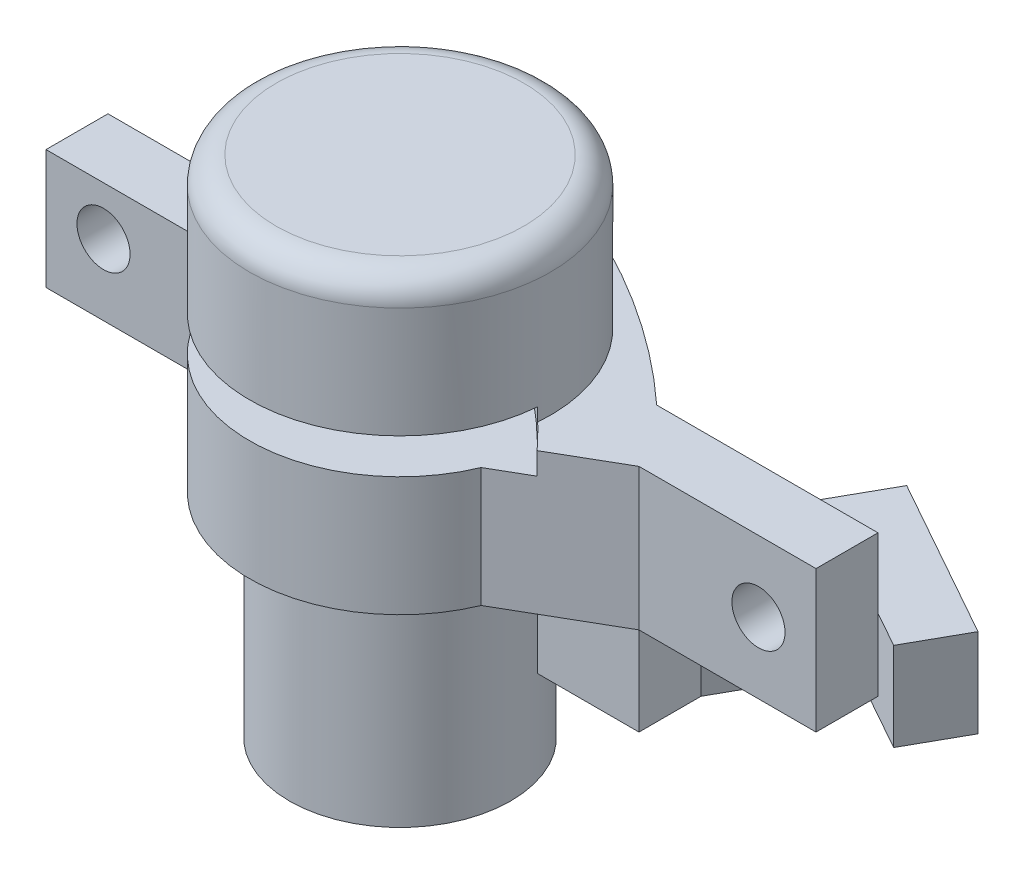
ISO-10303-21;
HEADER;
FILE_DESCRIPTION(('STEP AP214'),'2;1');
FILE_NAME('part.step','',(''),(''),'','','');
FILE_SCHEMA(('AUTOMOTIVE_DESIGN { 1 0 10303 214 1 1 1 1 }'));
ENDSEC;
DATA;
#1=APPLICATION_CONTEXT('core data for automotive mechanical design processes');
#2=APPLICATION_PROTOCOL_DEFINITION('international standard','automotive_design',2000,#1);
#3=PRODUCT_CONTEXT('',#1,'mechanical');
#4=PRODUCT('Part','Part','',(#3));
#5=PRODUCT_RELATED_PRODUCT_CATEGORY('part','',(#4));
#6=PRODUCT_DEFINITION_FORMATION('','',#4);
#7=PRODUCT_DEFINITION_CONTEXT('part definition',#1,'design');
#8=PRODUCT_DEFINITION('design','',#6,#7);
#9=PRODUCT_DEFINITION_SHAPE('','',#8);
#10=(LENGTH_UNIT() NAMED_UNIT(*) SI_UNIT(.MILLI.,.METRE.));
#11=(NAMED_UNIT(*) PLANE_ANGLE_UNIT() SI_UNIT($,.RADIAN.));
#12=(NAMED_UNIT(*) SI_UNIT($,.STERADIAN.) SOLID_ANGLE_UNIT());
#13=UNCERTAINTY_MEASURE_WITH_UNIT(LENGTH_MEASURE(1.E-05),#10,'distance_accuracy_value','');
#14=(GEOMETRIC_REPRESENTATION_CONTEXT(3) GLOBAL_UNCERTAINTY_ASSIGNED_CONTEXT((#13)) GLOBAL_UNIT_ASSIGNED_CONTEXT((#10,
#11,#12)) REPRESENTATION_CONTEXT('',''));
#15=CARTESIAN_POINT('',(0.,0.,0.));
#16=DIRECTION('',(0.,0.,1.));
#17=DIRECTION('',(1.,0.,0.));
#18=AXIS2_PLACEMENT_3D('',#15,#16,#17);
#19=CARTESIAN_POINT('',(0.,16.,0.));
#20=DIRECTION('',(1.,0.,0.));
#21=DIRECTION('',(0.,0.,-1.));
#22=AXIS2_PLACEMENT_3D('',#19,#20,#21);
#23=PLANE('',#22);
#24=DIRECTION('',(0.,0.,1.));
#25=VECTOR('',#24,1.);
#26=CARTESIAN_POINT('',(0.,13.5,0.));
#27=LINE('',#26,#25);
#28=CARTESIAN_POINT('',(0.,13.5,-7.));
#29=VERTEX_POINT('',#28);
#30=CARTESIAN_POINT('',(0.,13.5,0.));
#31=VERTEX_POINT('',#30);
#32=EDGE_CURVE('E384',#29,#31,#27,.T.);
#33=ORIENTED_EDGE('',*,*,#32,.F.);
#34=DIRECTION('',(0.,-1.,0.));
#35=VECTOR('',#34,1.);
#36=CARTESIAN_POINT('',(0.,16.,-7.));
#37=LINE('',#36,#35);
#38=CARTESIAN_POINT('',(0.,0.,-7.));
#39=VERTEX_POINT('',#38);
#40=EDGE_CURVE('E247',#29,#39,#37,.T.);
#41=ORIENTED_EDGE('',*,*,#40,.T.);
#42=DIRECTION('',(0.,0.,1.));
#43=VECTOR('',#42,1.);
#44=CARTESIAN_POINT('',(0.,0.,0.));
#45=LINE('',#44,#43);
#46=CARTESIAN_POINT('',(0.,0.,0.));
#47=VERTEX_POINT('',#46);
#48=EDGE_CURVE('E280',#39,#47,#45,.T.);
#49=ORIENTED_EDGE('',*,*,#48,.T.);
#50=DIRECTION('',(0.,-1.,0.));
#51=VECTOR('',#50,1.);
#52=CARTESIAN_POINT('',(0.,16.,0.));
#53=LINE('',#52,#51);
#54=EDGE_CURVE('E221',#31,#47,#53,.T.);
#55=ORIENTED_EDGE('',*,*,#54,.F.);
#56=EDGE_LOOP('',(#33,#41,#49,#55));
#57=FACE_BOUND('',#56,.T.);
#58=ADVANCED_FACE('F36',(#57),#23,.F.);
#59=CARTESIAN_POINT('',(0.,16.,0.));
#60=DIRECTION('',(0.,0.,-1.));
#61=DIRECTION('',(-1.,0.,0.));
#62=AXIS2_PLACEMENT_3D('',#59,#60,#61);
#63=PLANE('',#62);
#64=CARTESIAN_POINT('',(6.49999999999999,8.,0.));
#65=DIRECTION('',(0.,0.,-1.));
#66=DIRECTION('',(-1.,0.,0.));
#67=AXIS2_PLACEMENT_3D('',#64,#65,#66);
#68=CIRCLE('',#67,3.);
#69=CARTESIAN_POINT('',(3.49999999999999,8.,0.));
#70=VERTEX_POINT('',#69);
#71=EDGE_CURVE('E306',#70,#70,#68,.T.);
#72=ORIENTED_EDGE('',*,*,#71,.T.);
#73=EDGE_LOOP('',(#72));
#74=FACE_BOUND('',#73,.T.);
#75=DIRECTION('',(1.,0.,0.));
#76=VECTOR('',#75,1.);
#77=CARTESIAN_POINT('',(0.,13.5,0.));
#78=LINE('',#77,#76);
#79=CARTESIAN_POINT('',(23.,13.5,0.));
#80=VERTEX_POINT('',#79);
#81=EDGE_CURVE('E382',#31,#80,#78,.T.);
#82=ORIENTED_EDGE('',*,*,#81,.F.);
#83=ORIENTED_EDGE('',*,*,#54,.T.);
#84=DIRECTION('',(1.,0.,0.));
#85=VECTOR('',#84,1.);
#86=CARTESIAN_POINT('',(0.,0.,0.));
#87=LINE('',#86,#85);
#88=CARTESIAN_POINT('',(23.,0.,0.));
#89=VERTEX_POINT('',#88);
#90=EDGE_CURVE('E277',#47,#89,#87,.T.);
#91=ORIENTED_EDGE('',*,*,#90,.T.);
#92=DIRECTION('',(0.,-1.,0.));
#93=VECTOR('',#92,1.);
#94=CARTESIAN_POINT('',(23.,16.,0.));
#95=LINE('',#94,#93);
#96=EDGE_CURVE('E223',#80,#89,#95,.T.);
#97=ORIENTED_EDGE('',*,*,#96,.F.);
#98=EDGE_LOOP('',(#82,#83,#91,#97));
#99=FACE_BOUND('',#98,.T.);
#100=ADVANCED_FACE('F414',(#74,#99),#63,.F.);
#101=CARTESIAN_POINT('',(40.,16.,0.));
#102=DIRECTION('',(0.,-1.,0.));
#103=DIRECTION('',(0.,0.,-1.));
#104=AXIS2_PLACEMENT_3D('',#101,#102,#103);
#105=CYLINDRICAL_SURFACE('',#104,17.);
#106=CARTESIAN_POINT('',(40.,30.,0.));
#107=DIRECTION('',(0.,1.,0.));
#108=DIRECTION('',(0.,0.,1.));
#109=AXIS2_PLACEMENT_3D('',#106,#107,#108);
#110=CIRCLE('',#109,17.);
#111=CARTESIAN_POINT('',(40.,30.,17.));
#112=VERTEX_POINT('',#111);
#113=EDGE_CURVE('E11',#112,#112,#110,.F.);
#114=ORIENTED_EDGE('',*,*,#113,.T.);
#115=EDGE_LOOP('',(#114));
#116=FACE_BOUND('',#115,.T.);
#117=DIRECTION('',(0.,-1.,0.));
#118=VECTOR('',#117,1.);
#119=CARTESIAN_POINT('',(32.3442089952623,15.5,-15.1785659431903));
#120=LINE('',#119,#118);
#121=CARTESIAN_POINT('',(32.3442089952622,17.5,-15.1785659431903));
#122=VERTEX_POINT('',#121);
#123=CARTESIAN_POINT('',(32.3442089952623,16.,-15.1785659431903));
#124=VERTEX_POINT('',#123);
#125=EDGE_CURVE('E209',#122,#124,#120,.T.);
#126=ORIENTED_EDGE('',*,*,#125,.F.);
#127=CARTESIAN_POINT('',(40.,17.5,0.));
#128=DIRECTION('',(0.,1.,0.));
#129=DIRECTION('',(0.,0.,1.));
#130=AXIS2_PLACEMENT_3D('',#127,#128,#129);
#131=CIRCLE('',#130,17.);
#132=CARTESIAN_POINT('',(56.9434916866743,17.5,1.38495106902715));
#133=VERTEX_POINT('',#132);
#134=EDGE_CURVE('E205',#122,#133,#131,.T.);
#135=ORIENTED_EDGE('',*,*,#134,.T.);
#136=DIRECTION('',(0.,-1.,0.));
#137=VECTOR('',#136,1.);
#138=CARTESIAN_POINT('',(56.9434916866743,15.5,1.38495106902711));
#139=LINE('',#138,#137);
#140=CARTESIAN_POINT('',(56.9434916866743,16.,1.38495106902711));
#141=VERTEX_POINT('',#140);
#142=EDGE_CURVE('E191',#141,#133,#139,.F.);
#143=ORIENTED_EDGE('',*,*,#142,.F.);
#144=CARTESIAN_POINT('',(40.,16.,0.));
#145=DIRECTION('',(0.,1.,0.));
#146=DIRECTION('',(0.,0.,1.));
#147=AXIS2_PLACEMENT_3D('',#144,#145,#146);
#148=CIRCLE('',#147,17.);
#149=EDGE_CURVE('E283',#141,#124,#148,.T.);
#150=ORIENTED_EDGE('',*,*,#149,.T.);
#151=EDGE_LOOP('',(#126,#135,#143,#150));
#152=FACE_BOUND('',#151,.T.);
#153=ADVANCED_FACE('F208',(#116,#152),#105,.T.);
#154=CARTESIAN_POINT('',(40.,13.5,0.));
#155=DIRECTION('',(0.,1.,0.));
#156=DIRECTION('',(0.,0.,1.));
#157=AXIS2_PLACEMENT_3D('',#154,#155,#156);
#158=CIRCLE('',#157,17.);
#159=CARTESIAN_POINT('',(55.6977650840866,13.5,6.52534837114699));
#160=VERTEX_POINT('',#159);
#161=EDGE_CURVE('E380',#80,#160,#158,.T.);
#162=ORIENTED_EDGE('',*,*,#161,.F.);
#163=ORIENTED_EDGE('',*,*,#96,.T.);
#164=CARTESIAN_POINT('',(40.,0.,0.));
#165=DIRECTION('',(0.,1.,0.));
#166=DIRECTION('',(0.,0.,1.));
#167=AXIS2_PLACEMENT_3D('',#164,#165,#166);
#168=CIRCLE('',#167,17.);
#169=CARTESIAN_POINT('',(55.6977650840866,0.,6.52534837114699));
#170=VERTEX_POINT('',#169);
#171=EDGE_CURVE('E274',#89,#170,#168,.T.);
#172=ORIENTED_EDGE('',*,*,#171,.T.);
#173=DIRECTION('',(0.,-1.,0.));
#174=VECTOR('',#173,1.);
#175=CARTESIAN_POINT('',(55.6977650840866,16.,6.52534837114699));
#176=LINE('',#175,#174);
#177=EDGE_CURVE('E225',#160,#170,#176,.T.);
#178=ORIENTED_EDGE('',*,*,#177,.F.);
#179=EDGE_LOOP('',(#162,#163,#172,#178));
#180=FACE_BOUND('',#179,.T.);
#181=ADVANCED_FACE('F423',(#180),#105,.T.);
#182=CARTESIAN_POINT('',(55.6977650840866,16.,6.52534837114699));
#183=DIRECTION('',(-0.500000000000001,0.,-0.866025403784438));
#184=DIRECTION('',(-0.866025403784438,0.,0.500000000000001));
#185=AXIS2_PLACEMENT_3D('',#182,#183,#184);
#186=PLANE('',#185);
#187=DIRECTION('',(0.,-1.,0.));
#188=VECTOR('',#187,1.);
#189=CARTESIAN_POINT('',(59.6999214716968,17.5,4.2147023034213));
#190=LINE('',#189,#188);
#191=CARTESIAN_POINT('',(59.6999214716968,13.5,4.2147023034213));
#192=VERTEX_POINT('',#191);
#193=CARTESIAN_POINT('',(59.6999214716968,16.,4.2147023034213));
#194=VERTEX_POINT('',#193);
#195=EDGE_CURVE('E51',#192,#194,#190,.F.);
#196=ORIENTED_EDGE('',*,*,#195,.F.);
#197=DIRECTION('',(0.866025403784438,0.,-0.500000000000001));
#198=VECTOR('',#197,1.);
#199=CARTESIAN_POINT('',(55.6977650840866,13.5,6.52534837114699));
#200=LINE('',#199,#198);
#201=EDGE_CURVE('E356',#160,#192,#200,.T.);
#202=ORIENTED_EDGE('',*,*,#201,.F.);
#203=ORIENTED_EDGE('',*,*,#177,.T.);
#204=DIRECTION('',(0.866025403784438,0.,-0.500000000000001));
#205=VECTOR('',#204,1.);
#206=CARTESIAN_POINT('',(55.6977650840866,0.,6.52534837114699));
#207=LINE('',#206,#205);
#208=CARTESIAN_POINT('',(67.,0.,0.));
#209=VERTEX_POINT('',#208);
#210=EDGE_CURVE('E271',#170,#209,#207,.T.);
#211=ORIENTED_EDGE('',*,*,#210,.T.);
#212=DIRECTION('',(0.,-1.,0.));
#213=VECTOR('',#212,1.);
#214=CARTESIAN_POINT('',(67.,16.,0.));
#215=LINE('',#214,#213);
#216=CARTESIAN_POINT('',(67.,16.,0.));
#217=VERTEX_POINT('',#216);
#218=EDGE_CURVE('E227',#217,#209,#215,.T.);
#219=ORIENTED_EDGE('',*,*,#218,.F.);
#220=DIRECTION('',(0.866025403784438,0.,-0.500000000000001));
#221=VECTOR('',#220,1.);
#222=CARTESIAN_POINT('',(55.6977650840866,16.,6.52534837114699));
#223=LINE('',#222,#221);
#224=EDGE_CURVE('E253',#194,#217,#223,.T.);
#225=ORIENTED_EDGE('',*,*,#224,.F.);
#226=EDGE_LOOP('',(#196,#202,#203,#211,#219,#225));
#227=FACE_BOUND('',#226,.T.);
#228=ADVANCED_FACE('F425',(#227),#186,.F.);
#229=CARTESIAN_POINT('',(22.,16.,-7.));
#230=DIRECTION('',(0.996194698091745,0.,-0.087155742747662));
#231=DIRECTION('',(-0.087155742747662,0.,-0.996194698091745));
#232=AXIS2_PLACEMENT_3D('',#229,#230,#231);
#233=PLANE('',#232);
#234=DIRECTION('',(0.,-1.,0.));
#235=VECTOR('',#234,1.);
#236=CARTESIAN_POINT('',(20.9347437042288,17.5,-19.1759351765099));
#237=LINE('',#236,#235);
#238=CARTESIAN_POINT('',(20.9347437042288,16.,-19.1759351765099));
#239=VERTEX_POINT('',#238);
#240=CARTESIAN_POINT('',(20.9347437042288,13.5,-19.1759351765099));
#241=VERTEX_POINT('',#240);
#242=EDGE_CURVE('E201',#239,#241,#237,.T.);
#243=ORIENTED_EDGE('',*,*,#242,.F.);
#244=DIRECTION('',(0.087155742747662,0.,0.996194698091745));
#245=VECTOR('',#244,1.);
#246=CARTESIAN_POINT('',(22.,16.,-7.));
#247=LINE('',#246,#245);
#248=CARTESIAN_POINT('',(20.813284407895,16.,-20.5642212862617));
#249=VERTEX_POINT('',#248);
#250=EDGE_CURVE('E249',#249,#239,#247,.T.);
#251=ORIENTED_EDGE('',*,*,#250,.F.);
#252=DIRECTION('',(0.,-1.,0.));
#253=VECTOR('',#252,1.);
#254=CARTESIAN_POINT('',(20.813284407895,16.,-20.5642212862617));
#255=LINE('',#254,#253);
#256=CARTESIAN_POINT('',(20.813284407895,0.,-20.5642212862617));
#257=VERTEX_POINT('',#256);
#258=EDGE_CURVE('E242',#249,#257,#255,.T.);
#259=ORIENTED_EDGE('',*,*,#258,.T.);
#260=DIRECTION('',(0.087155742747662,0.,0.996194698091745));
#261=VECTOR('',#260,1.);
#262=CARTESIAN_POINT('',(22.,0.,-7.));
#263=LINE('',#262,#261);
#264=CARTESIAN_POINT('',(22.,0.,-7.));
#265=VERTEX_POINT('',#264);
#266=EDGE_CURVE('E254',#257,#265,#263,.T.);
#267=ORIENTED_EDGE('',*,*,#266,.T.);
#268=DIRECTION('',(0.,-1.,0.));
#269=VECTOR('',#268,1.);
#270=CARTESIAN_POINT('',(22.,16.,-7.));
#271=LINE('',#270,#269);
#272=CARTESIAN_POINT('',(22.,13.5,-7.));
#273=VERTEX_POINT('',#272);
#274=EDGE_CURVE('E245',#273,#265,#271,.T.);
#275=ORIENTED_EDGE('',*,*,#274,.F.);
#276=DIRECTION('',(0.087155742747662,0.,0.996194698091745));
#277=VECTOR('',#276,1.);
#278=CARTESIAN_POINT('',(22.,13.5,-7.));
#279=LINE('',#278,#277);
#280=EDGE_CURVE('E386',#241,#273,#279,.T.);
#281=ORIENTED_EDGE('',*,*,#280,.F.);
#282=EDGE_LOOP('',(#243,#251,#259,#267,#275,#281));
#283=FACE_BOUND('',#282,.T.);
#284=ADVANCED_FACE('F400',(#283),#233,.F.);
#285=CARTESIAN_POINT('',(0.,16.,-7.));
#286=DIRECTION('',(0.,0.,1.));
#287=DIRECTION('',(1.,0.,0.));
#288=AXIS2_PLACEMENT_3D('',#285,#286,#287);
#289=PLANE('',#288);
#290=CARTESIAN_POINT('',(6.49999999999999,8.,-7.));
#291=DIRECTION('',(0.,0.,-1.));
#292=DIRECTION('',(-1.,0.,0.));
#293=AXIS2_PLACEMENT_3D('',#290,#291,#292);
#294=CIRCLE('',#293,3.);
#295=CARTESIAN_POINT('',(3.49999999999999,8.,-7.));
#296=VERTEX_POINT('',#295);
#297=EDGE_CURVE('E310',#296,#296,#294,.T.);
#298=ORIENTED_EDGE('',*,*,#297,.F.);
#299=EDGE_LOOP('',(#298));
#300=FACE_BOUND('',#299,.T.);
#301=DIRECTION('',(-1.,0.,0.));
#302=VECTOR('',#301,1.);
#303=CARTESIAN_POINT('',(0.,13.5,-7.));
#304=LINE('',#303,#302);
#305=EDGE_CURVE('E210',#273,#29,#304,.T.);
#306=ORIENTED_EDGE('',*,*,#305,.F.);
#307=ORIENTED_EDGE('',*,*,#274,.T.);
#308=DIRECTION('',(-1.,0.,0.));
#309=VECTOR('',#308,1.);
#310=CARTESIAN_POINT('',(0.,0.,-7.));
#311=LINE('',#310,#309);
#312=EDGE_CURVE('E250',#265,#39,#311,.T.);
#313=ORIENTED_EDGE('',*,*,#312,.T.);
#314=ORIENTED_EDGE('',*,*,#40,.F.);
#315=EDGE_LOOP('',(#306,#307,#313,#314));
#316=FACE_BOUND('',#315,.T.);
#317=ADVANCED_FACE('F405',(#300,#316),#289,.F.);
#318=CARTESIAN_POINT('',(25.7942578983537,0.,-21.));
#319=DIRECTION('',(0.,1.,0.));
#320=DIRECTION('',(0.,0.,1.));
#321=AXIS2_PLACEMENT_3D('',#318,#319,#320);
#322=PLANE('',#321);
#323=DIRECTION('',(1.,0.,0.));
#324=VECTOR('',#323,1.);
#325=CARTESIAN_POINT('',(67.,0.,0.));
#326=LINE('',#325,#324);
#327=CARTESIAN_POINT('',(87.,0.,0.));
#328=VERTEX_POINT('',#327);
#329=EDGE_CURVE('E269',#209,#328,#326,.T.);
#330=ORIENTED_EDGE('',*,*,#329,.F.);
#331=DIRECTION('',(0.,0.,-1.));
#332=VECTOR('',#331,1.);
#333=CARTESIAN_POINT('',(67.,0.,0.));
#334=LINE('',#333,#332);
#335=CARTESIAN_POINT('',(67.,0.,-7.));
#336=VERTEX_POINT('',#335);
#337=EDGE_CURVE('E353',#209,#336,#334,.T.);
#338=ORIENTED_EDGE('',*,*,#337,.T.);
#339=DIRECTION('',(-1.,0.,0.));
#340=VECTOR('',#339,1.);
#341=CARTESIAN_POINT('',(87.,0.,-7.));
#342=LINE('',#341,#340);
#343=CARTESIAN_POINT('',(87.,0.,-7.));
#344=VERTEX_POINT('',#343);
#345=EDGE_CURVE('E263',#344,#336,#342,.T.);
#346=ORIENTED_EDGE('',*,*,#345,.F.);
#347=DIRECTION('',(0.,0.,-1.));
#348=VECTOR('',#347,1.);
#349=CARTESIAN_POINT('',(87.,0.,0.));
#350=LINE('',#349,#348);
#351=EDGE_CURVE('E267',#328,#344,#350,.T.);
#352=ORIENTED_EDGE('',*,*,#351,.F.);
#353=EDGE_LOOP('',(#330,#338,#346,#352));
#354=FACE_BOUND('',#353,.T.);
#355=ADVANCED_FACE('F456',(#354),#322,.F.);
#356=CARTESIAN_POINT('',(67.,16.,0.));
#357=DIRECTION('',(0.,0.,-1.));
#358=DIRECTION('',(-1.,0.,0.));
#359=AXIS2_PLACEMENT_3D('',#356,#357,#358);
#360=PLANE('',#359);
#361=CARTESIAN_POINT('',(80.5,8.,0.));
#362=DIRECTION('',(0.,0.,-1.));
#363=DIRECTION('',(-1.,0.,0.));
#364=AXIS2_PLACEMENT_3D('',#361,#362,#363);
#365=CIRCLE('',#364,3.00000000000001);
#366=CARTESIAN_POINT('',(77.5,8.,0.));
#367=VERTEX_POINT('',#366);
#368=EDGE_CURVE('E303',#367,#367,#365,.T.);
#369=ORIENTED_EDGE('',*,*,#368,.T.);
#370=EDGE_LOOP('',(#369));
#371=FACE_BOUND('',#370,.T.);
#372=ORIENTED_EDGE('',*,*,#329,.T.);
#373=DIRECTION('',(0.,-1.,0.));
#374=VECTOR('',#373,1.);
#375=CARTESIAN_POINT('',(87.,16.,0.));
#376=LINE('',#375,#374);
#377=CARTESIAN_POINT('',(87.,16.,0.));
#378=VERTEX_POINT('',#377);
#379=EDGE_CURVE('E230',#378,#328,#376,.T.);
#380=ORIENTED_EDGE('',*,*,#379,.F.);
#381=DIRECTION('',(1.,0.,0.));
#382=VECTOR('',#381,1.);
#383=CARTESIAN_POINT('',(67.,16.,0.));
#384=LINE('',#383,#382);
#385=EDGE_CURVE('E294',#217,#378,#384,.T.);
#386=ORIENTED_EDGE('',*,*,#385,.F.);
#387=ORIENTED_EDGE('',*,*,#218,.T.);
#388=EDGE_LOOP('',(#372,#380,#386,#387));
#389=FACE_BOUND('',#388,.T.);
#390=ADVANCED_FACE('F465',(#371,#389),#360,.F.);
#391=CARTESIAN_POINT('',(87.,16.,0.));
#392=DIRECTION('',(-1.,0.,0.));
#393=DIRECTION('',(0.,0.,1.));
#394=AXIS2_PLACEMENT_3D('',#391,#392,#393);
#395=PLANE('',#394);
#396=ORIENTED_EDGE('',*,*,#351,.T.);
#397=DIRECTION('',(0.,-1.,0.));
#398=VECTOR('',#397,1.);
#399=CARTESIAN_POINT('',(87.,16.,-7.));
#400=LINE('',#399,#398);
#401=CARTESIAN_POINT('',(87.,16.,-7.));
#402=VERTEX_POINT('',#401);
#403=EDGE_CURVE('E233',#402,#344,#400,.T.);
#404=ORIENTED_EDGE('',*,*,#403,.F.);
#405=DIRECTION('',(0.,0.,-1.));
#406=VECTOR('',#405,1.);
#407=CARTESIAN_POINT('',(87.,16.,0.));
#408=LINE('',#407,#406);
#409=EDGE_CURVE('E292',#378,#402,#408,.T.);
#410=ORIENTED_EDGE('',*,*,#409,.F.);
#411=ORIENTED_EDGE('',*,*,#379,.T.);
#412=EDGE_LOOP('',(#396,#404,#410,#411));
#413=FACE_BOUND('',#412,.T.);
#414=ADVANCED_FACE('F468',(#413),#395,.F.);
#415=CARTESIAN_POINT('',(87.,16.,-7.));
#416=DIRECTION('',(0.,0.,1.));
#417=DIRECTION('',(1.,0.,0.));
#418=AXIS2_PLACEMENT_3D('',#415,#416,#417);
#419=PLANE('',#418);
#420=CARTESIAN_POINT('',(80.5,8.,-7.));
#421=DIRECTION('',(0.,0.,-1.));
#422=DIRECTION('',(-1.,0.,0.));
#423=AXIS2_PLACEMENT_3D('',#420,#421,#422);
#424=CIRCLE('',#423,3.00000000000001);
#425=CARTESIAN_POINT('',(77.5,8.,-7.));
#426=VERTEX_POINT('',#425);
#427=EDGE_CURVE('E309',#426,#426,#424,.T.);
#428=ORIENTED_EDGE('',*,*,#427,.F.);
#429=EDGE_LOOP('',(#428));
#430=FACE_BOUND('',#429,.T.);
#431=ORIENTED_EDGE('',*,*,#345,.T.);
#432=CARTESIAN_POINT('',(62.,0.,-6.99999999999998));
#433=VERTEX_POINT('',#432);
#434=EDGE_CURVE('E266',#336,#433,#342,.T.);
#435=ORIENTED_EDGE('',*,*,#434,.T.);
#436=DIRECTION('',(0.,-1.,0.));
#437=VECTOR('',#436,1.);
#438=CARTESIAN_POINT('',(62.,16.,-7.));
#439=LINE('',#438,#437);
#440=CARTESIAN_POINT('',(62.,16.,-7.));
#441=VERTEX_POINT('',#440);
#442=EDGE_CURVE('E236',#441,#433,#439,.T.);
#443=ORIENTED_EDGE('',*,*,#442,.F.);
#444=DIRECTION('',(-1.,0.,0.));
#445=VECTOR('',#444,1.);
#446=CARTESIAN_POINT('',(87.,16.,-7.));
#447=LINE('',#446,#445);
#448=EDGE_CURVE('E290',#402,#441,#447,.T.);
#449=ORIENTED_EDGE('',*,*,#448,.F.);
#450=ORIENTED_EDGE('',*,*,#403,.T.);
#451=EDGE_LOOP('',(#431,#435,#443,#449,#450));
#452=FACE_BOUND('',#451,.T.);
#453=ADVANCED_FACE('F449',(#430,#452),#419,.F.);
#454=CARTESIAN_POINT('',(7.75190241206248,16.,51.7974821577388));
#455=DIRECTION('',(0.,-1.,0.));
#456=DIRECTION('',(0.,0.,-1.));
#457=AXIS2_PLACEMENT_3D('',#454,#455,#456);
#458=CYLINDRICAL_SURFACE('',#457,80.);
#459=CARTESIAN_POINT('',(7.75190241206248,0.,51.7974821577388));
#460=DIRECTION('',(0.,1.,0.));
#461=DIRECTION('',(0.,0.,-1.));
#462=AXIS2_PLACEMENT_3D('',#459,#460,#461);
#463=CIRCLE('',#462,80.);
#464=CARTESIAN_POINT('',(57.635829318452,0.,-10.7452539224647));
#465=VERTEX_POINT('',#464);
#466=EDGE_CURVE('E259',#433,#465,#463,.T.);
#467=ORIENTED_EDGE('',*,*,#466,.T.);
#468=CARTESIAN_POINT('',(26.9970815974398,0.,-25.8531654771826));
#469=VERTEX_POINT('',#468);
#470=EDGE_CURVE('E262',#465,#469,#463,.T.);
#471=ORIENTED_EDGE('',*,*,#470,.T.);
#472=DIRECTION('',(0.,-1.,0.));
#473=VECTOR('',#472,1.);
#474=CARTESIAN_POINT('',(26.9970815974398,16.,-25.8531654771826));
#475=LINE('',#474,#473);
#476=CARTESIAN_POINT('',(26.9970815974398,16.,-25.8531654771826));
#477=VERTEX_POINT('',#476);
#478=EDGE_CURVE('E239',#477,#469,#475,.T.);
#479=ORIENTED_EDGE('',*,*,#478,.F.);
#480=CARTESIAN_POINT('',(7.75190241206248,16.,51.7974821577388));
#481=DIRECTION('',(0.,1.,0.));
#482=DIRECTION('',(0.,0.,-1.));
#483=AXIS2_PLACEMENT_3D('',#480,#481,#482);
#484=CIRCLE('',#483,80.);
#485=EDGE_CURVE('E288',#441,#477,#484,.T.);
#486=ORIENTED_EDGE('',*,*,#485,.F.);
#487=ORIENTED_EDGE('',*,*,#442,.T.);
#488=EDGE_LOOP('',(#467,#471,#479,#486,#487));
#489=FACE_BOUND('',#488,.T.);
#490=ADVANCED_FACE('F442',(#489),#458,.T.);
#491=CARTESIAN_POINT('',(25.7942578983537,16.,-21.));
#492=DIRECTION('',(0.,-1.,0.));
#493=DIRECTION('',(0.,0.,-1.));
#494=AXIS2_PLACEMENT_3D('',#491,#492,#493);
#495=CYLINDRICAL_SURFACE('',#494,5.);
#496=CARTESIAN_POINT('',(25.7942578983537,0.,-21.));
#497=DIRECTION('',(0.,1.,0.));
#498=DIRECTION('',(0.,0.,1.));
#499=AXIS2_PLACEMENT_3D('',#496,#497,#498);
#500=CIRCLE('',#499,5.);
#501=EDGE_CURVE('E257',#469,#257,#500,.T.);
#502=ORIENTED_EDGE('',*,*,#501,.T.);
#503=ORIENTED_EDGE('',*,*,#258,.F.);
#504=CARTESIAN_POINT('',(25.7942578983537,16.,-21.));
#505=DIRECTION('',(0.,1.,0.));
#506=DIRECTION('',(0.,0.,1.));
#507=AXIS2_PLACEMENT_3D('',#504,#505,#506);
#508=CIRCLE('',#507,5.);
#509=EDGE_CURVE('E286',#477,#249,#508,.T.);
#510=ORIENTED_EDGE('',*,*,#509,.F.);
#511=ORIENTED_EDGE('',*,*,#478,.T.);
#512=EDGE_LOOP('',(#502,#503,#510,#511));
#513=FACE_BOUND('',#512,.T.);
#514=ADVANCED_FACE('F438',(#513),#495,.T.);
#515=CARTESIAN_POINT('',(25.7942578983537,16.,-21.));
#516=DIRECTION('',(0.,1.,0.));
#517=DIRECTION('',(0.,0.,1.));
#518=AXIS2_PLACEMENT_3D('',#515,#516,#517);
#519=PLANE('',#518);
#520=ORIENTED_EDGE('',*,*,#250,.T.);
#521=CARTESIAN_POINT('',(-0.399999999999921,16.,59.9999999999999));
#522=DIRECTION('',(0.,1.,0.));
#523=DIRECTION('',(0.,0.,1.));
#524=AXIS2_PLACEMENT_3D('',#521,#522,#523);
#525=CIRCLE('',#524,82.);
#526=EDGE_CURVE('E213',#239,#124,#525,.F.);
#527=ORIENTED_EDGE('',*,*,#526,.T.);
#528=ORIENTED_EDGE('',*,*,#149,.F.);
#529=EDGE_CURVE('E196',#141,#194,#525,.F.);
#530=ORIENTED_EDGE('',*,*,#529,.T.);
#531=ORIENTED_EDGE('',*,*,#224,.T.);
#532=ORIENTED_EDGE('',*,*,#385,.T.);
#533=ORIENTED_EDGE('',*,*,#409,.T.);
#534=ORIENTED_EDGE('',*,*,#448,.T.);
#535=ORIENTED_EDGE('',*,*,#485,.T.);
#536=ORIENTED_EDGE('',*,*,#509,.T.);
#537=EDGE_LOOP('',(#520,#527,#528,#530,#531,#532,#533,#534,#535,#536));
#538=FACE_BOUND('',#537,.T.);
#539=ADVANCED_FACE('F430',(#538),#519,.T.);
#540=CARTESIAN_POINT('',(40.,0.,0.));
#541=DIRECTION('',(0.,-1.,0.));
#542=DIRECTION('',(0.,0.,-1.));
#543=AXIS2_PLACEMENT_3D('',#540,#541,#542);
#544=CIRCLE('',#543,12.5);
#545=CARTESIAN_POINT('',(40.,0.,-12.5));
#546=VERTEX_POINT('',#545);
#547=EDGE_CURVE('E220',#546,#546,#544,.T.);
#548=ORIENTED_EDGE('',*,*,#547,.F.);
#549=EDGE_LOOP('',(#548));
#550=FACE_BOUND('',#549,.T.);
#551=DIRECTION('',(0.,0.,1.));
#552=VECTOR('',#551,1.);
#553=CARTESIAN_POINT('',(55.5122723791834,0.,-6.95481168932879));
#554=LINE('',#553,#552);
#555=CARTESIAN_POINT('',(55.5122723791834,0.,-6.95481168932879));
#556=VERTEX_POINT('',#555);
#557=CARTESIAN_POINT('',(55.5122723791834,0.,0.));
#558=VERTEX_POINT('',#557);
#559=EDGE_CURVE('E59',#556,#558,#554,.T.);
#560=ORIENTED_EDGE('',*,*,#559,.T.);
#561=DIRECTION('',(1.,0.,0.));
#562=VECTOR('',#561,1.);
#563=CARTESIAN_POINT('',(55.5122723791834,0.,0.));
#564=LINE('',#563,#562);
#565=EDGE_CURVE('E333',#558,#209,#564,.T.);
#566=ORIENTED_EDGE('',*,*,#565,.T.);
#567=ORIENTED_EDGE('',*,*,#210,.F.);
#568=ORIENTED_EDGE('',*,*,#171,.F.);
#569=ORIENTED_EDGE('',*,*,#90,.F.);
#570=ORIENTED_EDGE('',*,*,#48,.F.);
#571=ORIENTED_EDGE('',*,*,#312,.F.);
#572=ORIENTED_EDGE('',*,*,#266,.F.);
#573=ORIENTED_EDGE('',*,*,#501,.F.);
#574=ORIENTED_EDGE('',*,*,#470,.F.);
#575=DIRECTION('',(-0.488762681699899,0.,0.872416781691826));
#576=VECTOR('',#575,1.);
#577=CARTESIAN_POINT('',(54.4019020675865,0.,-4.97285658105345));
#578=LINE('',#577,#576);
#579=EDGE_CURVE('E217',#465,#556,#578,.T.);
#580=ORIENTED_EDGE('',*,*,#579,.T.);
#581=EDGE_LOOP('',(#560,#566,#567,#568,#569,#570,#571,#572,#573,#574,#580));
#582=FACE_BOUND('',#581,.T.);
#583=ADVANCED_FACE('F418',(#550,#582),#322,.F.);
#584=CARTESIAN_POINT('',(40.,33.,0.));
#585=DIRECTION('',(0.,1.,0.));
#586=DIRECTION('',(0.,0.,1.));
#587=AXIS2_PLACEMENT_3D('',#584,#585,#586);
#588=PLANE('',#587);
#589=CARTESIAN_POINT('',(40.,33.,0.));
#590=DIRECTION('',(0.,1.,0.));
#591=DIRECTION('',(0.,0.,1.));
#592=AXIS2_PLACEMENT_3D('',#589,#590,#591);
#593=CIRCLE('',#592,14.);
#594=CARTESIAN_POINT('',(40.,33.,14.));
#595=VERTEX_POINT('',#594);
#596=EDGE_CURVE('E44',#595,#595,#593,.T.);
#597=ORIENTED_EDGE('',*,*,#596,.T.);
#598=EDGE_LOOP('',(#597));
#599=FACE_BOUND('',#598,.T.);
#600=ADVANCED_FACE('F620',(#599),#588,.T.);
#601=CARTESIAN_POINT('',(40.,-24.,0.));
#602=DIRECTION('',(0.,1.,0.));
#603=DIRECTION('',(0.,0.,1.));
#604=AXIS2_PLACEMENT_3D('',#601,#602,#603);
#605=CYLINDRICAL_SURFACE('',#604,12.5);
#606=CARTESIAN_POINT('',(40.,-24.,0.));
#607=DIRECTION('',(0.,-1.,0.));
#608=DIRECTION('',(0.,0.,-1.));
#609=AXIS2_PLACEMENT_3D('',#606,#607,#608);
#610=CIRCLE('',#609,12.5);
#611=CARTESIAN_POINT('',(40.,-24.,-12.5));
#612=VERTEX_POINT('',#611);
#613=EDGE_CURVE('E298',#612,#612,#610,.T.);
#614=ORIENTED_EDGE('',*,*,#613,.F.);
#615=EDGE_LOOP('',(#614));
#616=FACE_BOUND('',#615,.T.);
#617=ORIENTED_EDGE('',*,*,#547,.T.);
#618=EDGE_LOOP('',(#617));
#619=FACE_BOUND('',#618,.T.);
#620=ADVANCED_FACE('F683',(#616,#619),#605,.T.);
#621=CARTESIAN_POINT('',(40.,-24.,0.));
#622=DIRECTION('',(0.,-1.,0.));
#623=DIRECTION('',(0.,0.,-1.));
#624=AXIS2_PLACEMENT_3D('',#621,#622,#623);
#625=PLANE('',#624);
#626=ORIENTED_EDGE('',*,*,#613,.T.);
#627=EDGE_LOOP('',(#626));
#628=FACE_BOUND('',#627,.T.);
#629=ADVANCED_FACE('F673',(#628),#625,.T.);
#630=CARTESIAN_POINT('',(6.49999999999999,8.,17.));
#631=DIRECTION('',(0.,0.,-1.));
#632=DIRECTION('',(-1.,0.,0.));
#633=AXIS2_PLACEMENT_3D('',#630,#631,#632);
#634=CYLINDRICAL_SURFACE('',#633,3.);
#635=ORIENTED_EDGE('',*,*,#297,.T.);
#636=EDGE_LOOP('',(#635));
#637=FACE_BOUND('',#636,.T.);
#638=ORIENTED_EDGE('',*,*,#71,.F.);
#639=EDGE_LOOP('',(#638));
#640=FACE_BOUND('',#639,.T.);
#641=ADVANCED_FACE('F663',(#637,#640),#634,.F.);
#642=CARTESIAN_POINT('',(80.5,8.,17.));
#643=DIRECTION('',(0.,0.,-1.));
#644=DIRECTION('',(-1.,0.,0.));
#645=AXIS2_PLACEMENT_3D('',#642,#643,#644);
#646=CYLINDRICAL_SURFACE('',#645,3.00000000000001);
#647=ORIENTED_EDGE('',*,*,#427,.T.);
#648=EDGE_LOOP('',(#647));
#649=FACE_BOUND('',#648,.T.);
#650=ORIENTED_EDGE('',*,*,#368,.F.);
#651=EDGE_LOOP('',(#650));
#652=FACE_BOUND('',#651,.T.);
#653=ADVANCED_FACE('F609',(#649,#652),#646,.F.);
#654=CARTESIAN_POINT('',(67.,-10.,0.));
#655=DIRECTION('',(1.,0.,0.));
#656=DIRECTION('',(0.,0.,-1.));
#657=AXIS2_PLACEMENT_3D('',#654,#655,#656);
#658=PLANE('',#657);
#659=ORIENTED_EDGE('',*,*,#337,.F.);
#660=DIRECTION('',(0.,1.,0.));
#661=VECTOR('',#660,1.);
#662=CARTESIAN_POINT('',(67.,-10.,0.));
#663=LINE('',#662,#661);
#664=CARTESIAN_POINT('',(67.,-10.,0.));
#665=VERTEX_POINT('',#664);
#666=EDGE_CURVE('E313',#665,#209,#663,.T.);
#667=ORIENTED_EDGE('',*,*,#666,.F.);
#668=DIRECTION('',(0.,0.,-1.));
#669=VECTOR('',#668,1.);
#670=CARTESIAN_POINT('',(67.,-10.,0.));
#671=LINE('',#670,#669);
#672=CARTESIAN_POINT('',(67.,-10.,-7.));
#673=VERTEX_POINT('',#672);
#674=EDGE_CURVE('E336',#665,#673,#671,.T.);
#675=ORIENTED_EDGE('',*,*,#674,.T.);
#676=DIRECTION('',(0.,1.,0.));
#677=VECTOR('',#676,1.);
#678=CARTESIAN_POINT('',(67.,-10.,-7.));
#679=LINE('',#678,#677);
#680=EDGE_CURVE('E316',#673,#336,#679,.T.);
#681=ORIENTED_EDGE('',*,*,#680,.T.);
#682=EDGE_LOOP('',(#659,#667,#675,#681));
#683=FACE_BOUND('',#682,.T.);
#684=ADVANCED_FACE('F459',(#683),#658,.T.);
#685=CARTESIAN_POINT('',(55.5122723791834,-10.,0.));
#686=DIRECTION('',(0.,0.,1.));
#687=DIRECTION('',(1.,0.,0.));
#688=AXIS2_PLACEMENT_3D('',#685,#686,#687);
#689=PLANE('',#688);
#690=ORIENTED_EDGE('',*,*,#565,.F.);
#691=DIRECTION('',(0.,1.,0.));
#692=VECTOR('',#691,1.);
#693=CARTESIAN_POINT('',(55.5122723791834,-10.,0.));
#694=LINE('',#693,#692);
#695=CARTESIAN_POINT('',(55.5122723791834,-10.,0.));
#696=VERTEX_POINT('',#695);
#697=EDGE_CURVE('E330',#696,#558,#694,.T.);
#698=ORIENTED_EDGE('',*,*,#697,.F.);
#699=DIRECTION('',(1.,0.,0.));
#700=VECTOR('',#699,1.);
#701=CARTESIAN_POINT('',(55.5122723791834,-10.,0.));
#702=LINE('',#701,#700);
#703=EDGE_CURVE('E320',#696,#665,#702,.T.);
#704=ORIENTED_EDGE('',*,*,#703,.T.);
#705=ORIENTED_EDGE('',*,*,#666,.T.);
#706=EDGE_LOOP('',(#690,#698,#704,#705));
#707=FACE_BOUND('',#706,.T.);
#708=ADVANCED_FACE('F592',(#707),#689,.T.);
#709=CARTESIAN_POINT('',(55.5122723791834,-10.,-6.95481168932879));
#710=DIRECTION('',(-1.,0.,0.));
#711=DIRECTION('',(0.,0.,1.));
#712=AXIS2_PLACEMENT_3D('',#709,#710,#711);
#713=PLANE('',#712);
#714=ORIENTED_EDGE('',*,*,#559,.F.);
#715=DIRECTION('',(0.,1.,0.));
#716=VECTOR('',#715,1.);
#717=CARTESIAN_POINT('',(55.5122723791834,-10.,-6.95481168932879));
#718=LINE('',#717,#716);
#719=CARTESIAN_POINT('',(55.5122723791834,-10.,-6.95481168932879));
#720=VERTEX_POINT('',#719);
#721=EDGE_CURVE('E328',#720,#556,#718,.T.);
#722=ORIENTED_EDGE('',*,*,#721,.F.);
#723=DIRECTION('',(0.,0.,1.));
#724=VECTOR('',#723,1.);
#725=CARTESIAN_POINT('',(55.5122723791834,-10.,-6.95481168932879));
#726=LINE('',#725,#724);
#727=EDGE_CURVE('E359',#720,#696,#726,.T.);
#728=ORIENTED_EDGE('',*,*,#727,.T.);
#729=ORIENTED_EDGE('',*,*,#697,.T.);
#730=EDGE_LOOP('',(#714,#722,#728,#729));
#731=FACE_BOUND('',#730,.T.);
#732=ADVANCED_FACE('F582',(#731),#713,.T.);
#733=CARTESIAN_POINT('',(68.,-10.,-29.2447768390949));
#734=DIRECTION('',(-0.872416781691826,0.,-0.488762681699899));
#735=DIRECTION('',(-0.488762681699899,0.,0.872416781691826));
#736=AXIS2_PLACEMENT_3D('',#733,#734,#735);
#737=PLANE('',#736);
#738=DIRECTION('',(-0.488762681699899,0.,0.872416781691826));
#739=VECTOR('',#738,1.);
#740=CARTESIAN_POINT('',(68.,0.,-29.2447768390949));
#741=LINE('',#740,#739);
#742=CARTESIAN_POINT('',(68.,0.,-29.2447768390949));
#743=VERTEX_POINT('',#742);
#744=EDGE_CURVE('E338',#743,#465,#741,.T.);
#745=ORIENTED_EDGE('',*,*,#744,.F.);
#746=DIRECTION('',(0.,1.,0.));
#747=VECTOR('',#746,1.);
#748=CARTESIAN_POINT('',(68.,-10.,-29.2447768390949));
#749=LINE('',#748,#747);
#750=CARTESIAN_POINT('',(68.,-10.,-29.2447768390949));
#751=VERTEX_POINT('',#750);
#752=EDGE_CURVE('E326',#751,#743,#749,.T.);
#753=ORIENTED_EDGE('',*,*,#752,.F.);
#754=DIRECTION('',(-0.488762681699899,0.,0.872416781691826));
#755=VECTOR('',#754,1.);
#756=CARTESIAN_POINT('',(68.,-10.,-29.2447768390949));
#757=LINE('',#756,#755);
#758=EDGE_CURVE('E362',#751,#720,#757,.T.);
#759=ORIENTED_EDGE('',*,*,#758,.T.);
#760=ORIENTED_EDGE('',*,*,#721,.T.);
#761=ORIENTED_EDGE('',*,*,#579,.F.);
#762=EDGE_LOOP('',(#745,#753,#759,#760,#761));
#763=FACE_BOUND('',#762,.T.);
#764=ADVANCED_FACE('F572',(#763),#737,.T.);
#765=CARTESIAN_POINT('',(68.,-10.,-29.2447768390949));
#766=DIRECTION('',(0.4887626816999,0.,-0.872416781691826));
#767=DIRECTION('',(-0.872416781691826,0.,-0.4887626816999));
#768=AXIS2_PLACEMENT_3D('',#765,#766,#767);
#769=PLANE('',#768);
#770=DIRECTION('',(-0.872416781691826,0.,-0.4887626816999));
#771=VECTOR('',#770,1.);
#772=CARTESIAN_POINT('',(68.,0.,-29.2447768390949));
#773=LINE('',#772,#771);
#774=CARTESIAN_POINT('',(86.3207524155283,0.,-18.9807605233971));
#775=VERTEX_POINT('',#774);
#776=EDGE_CURVE('E341',#775,#743,#773,.T.);
#777=ORIENTED_EDGE('',*,*,#776,.F.);
#778=DIRECTION('',(0.,1.,0.));
#779=VECTOR('',#778,1.);
#780=CARTESIAN_POINT('',(86.3207524155283,-10.,-18.9807605233971));
#781=LINE('',#780,#779);
#782=CARTESIAN_POINT('',(86.3207524155283,-10.,-18.9807605233971));
#783=VERTEX_POINT('',#782);
#784=EDGE_CURVE('E324',#783,#775,#781,.T.);
#785=ORIENTED_EDGE('',*,*,#784,.F.);
#786=DIRECTION('',(-0.872416781691826,0.,-0.4887626816999));
#787=VECTOR('',#786,1.);
#788=CARTESIAN_POINT('',(68.,-10.,-29.2447768390949));
#789=LINE('',#788,#787);
#790=EDGE_CURVE('E365',#783,#751,#789,.T.);
#791=ORIENTED_EDGE('',*,*,#790,.T.);
#792=ORIENTED_EDGE('',*,*,#752,.T.);
#793=EDGE_LOOP('',(#777,#785,#791,#792));
#794=FACE_BOUND('',#793,.T.);
#795=ADVANCED_FACE('F562',(#794),#769,.T.);
#796=CARTESIAN_POINT('',(86.3207524155283,-10.,-18.9807605233971));
#797=DIRECTION('',(0.872416781691826,0.,0.488762681699899));
#798=DIRECTION('',(0.488762681699899,0.,-0.872416781691826));
#799=AXIS2_PLACEMENT_3D('',#796,#797,#798);
#800=PLANE('',#799);
#801=DIRECTION('',(0.488762681699899,0.,-0.872416781691826));
#802=VECTOR('',#801,1.);
#803=CARTESIAN_POINT('',(86.3207524155283,0.,-18.9807605233971));
#804=LINE('',#803,#802);
#805=CARTESIAN_POINT('',(82.899413643629,0.,-12.8738430515543));
#806=VERTEX_POINT('',#805);
#807=EDGE_CURVE('E344',#806,#775,#804,.T.);
#808=ORIENTED_EDGE('',*,*,#807,.F.);
#809=DIRECTION('',(0.,1.,0.));
#810=VECTOR('',#809,1.);
#811=CARTESIAN_POINT('',(82.899413643629,-10.,-12.8738430515543));
#812=LINE('',#811,#810);
#813=CARTESIAN_POINT('',(82.899413643629,-10.,-12.8738430515543));
#814=VERTEX_POINT('',#813);
#815=EDGE_CURVE('E322',#814,#806,#812,.T.);
#816=ORIENTED_EDGE('',*,*,#815,.F.);
#817=DIRECTION('',(0.488762681699899,0.,-0.872416781691826));
#818=VECTOR('',#817,1.);
#819=CARTESIAN_POINT('',(86.3207524155283,-10.,-18.9807605233971));
#820=LINE('',#819,#818);
#821=EDGE_CURVE('E368',#814,#783,#820,.T.);
#822=ORIENTED_EDGE('',*,*,#821,.T.);
#823=ORIENTED_EDGE('',*,*,#784,.T.);
#824=EDGE_LOOP('',(#808,#816,#822,#823));
#825=FACE_BOUND('',#824,.T.);
#826=ADVANCED_FACE('F552',(#825),#800,.T.);
#827=CARTESIAN_POINT('',(82.899413643629,-10.,-12.8738430515543));
#828=DIRECTION('',(-0.488762681699899,0.,0.872416781691826));
#829=DIRECTION('',(0.872416781691826,0.,0.488762681699899));
#830=AXIS2_PLACEMENT_3D('',#827,#828,#829);
#831=PLANE('',#830);
#832=DIRECTION('',(0.872416781691826,0.,0.488762681699899));
#833=VECTOR('',#832,1.);
#834=CARTESIAN_POINT('',(82.899413643629,0.,-12.8738430515543));
#835=LINE('',#834,#833);
#836=CARTESIAN_POINT('',(73.302829045019,0.,-18.2502325502531));
#837=VERTEX_POINT('',#836);
#838=EDGE_CURVE('E347',#837,#806,#835,.T.);
#839=ORIENTED_EDGE('',*,*,#838,.F.);
#840=DIRECTION('',(0.,1.,0.));
#841=VECTOR('',#840,1.);
#842=CARTESIAN_POINT('',(73.302829045019,-10.,-18.2502325502531));
#843=LINE('',#842,#841);
#844=CARTESIAN_POINT('',(73.302829045019,-10.,-18.2502325502531));
#845=VERTEX_POINT('',#844);
#846=EDGE_CURVE('E319',#845,#837,#843,.T.);
#847=ORIENTED_EDGE('',*,*,#846,.F.);
#848=DIRECTION('',(0.872416781691826,0.,0.488762681699899));
#849=VECTOR('',#848,1.);
#850=CARTESIAN_POINT('',(82.899413643629,-10.,-12.8738430515543));
#851=LINE('',#850,#849);
#852=EDGE_CURVE('E371',#845,#814,#851,.T.);
#853=ORIENTED_EDGE('',*,*,#852,.T.);
#854=ORIENTED_EDGE('',*,*,#815,.T.);
#855=EDGE_LOOP('',(#839,#847,#853,#854));
#856=FACE_BOUND('',#855,.T.);
#857=ADVANCED_FACE('F542',(#856),#831,.T.);
#858=CARTESIAN_POINT('',(67.,-10.,-7.));
#859=DIRECTION('',(0.872416781691826,0.,0.488762681699899));
#860=DIRECTION('',(0.488762681699899,0.,-0.872416781691826));
#861=AXIS2_PLACEMENT_3D('',#858,#859,#860);
#862=PLANE('',#861);
#863=DIRECTION('',(0.488762681699899,0.,-0.872416781691826));
#864=VECTOR('',#863,1.);
#865=CARTESIAN_POINT('',(67.,0.,-7.));
#866=LINE('',#865,#864);
#867=EDGE_CURVE('E350',#336,#837,#866,.T.);
#868=ORIENTED_EDGE('',*,*,#867,.F.);
#869=ORIENTED_EDGE('',*,*,#680,.F.);
#870=DIRECTION('',(0.488762681699899,0.,-0.872416781691826));
#871=VECTOR('',#870,1.);
#872=CARTESIAN_POINT('',(67.,-10.,-7.));
#873=LINE('',#872,#871);
#874=EDGE_CURVE('E374',#673,#845,#873,.T.);
#875=ORIENTED_EDGE('',*,*,#874,.T.);
#876=ORIENTED_EDGE('',*,*,#846,.T.);
#877=EDGE_LOOP('',(#868,#869,#875,#876));
#878=FACE_BOUND('',#877,.T.);
#879=ADVANCED_FACE('F532',(#878),#862,.T.);
#880=CARTESIAN_POINT('',(0.,-10.,0.));
#881=DIRECTION('',(0.,-1.,0.));
#882=DIRECTION('',(0.,0.,-1.));
#883=AXIS2_PLACEMENT_3D('',#880,#881,#882);
#884=PLANE('',#883);
#885=ORIENTED_EDGE('',*,*,#674,.F.);
#886=ORIENTED_EDGE('',*,*,#703,.F.);
#887=ORIENTED_EDGE('',*,*,#727,.F.);
#888=ORIENTED_EDGE('',*,*,#758,.F.);
#889=ORIENTED_EDGE('',*,*,#790,.F.);
#890=ORIENTED_EDGE('',*,*,#821,.F.);
#891=ORIENTED_EDGE('',*,*,#852,.F.);
#892=ORIENTED_EDGE('',*,*,#874,.F.);
#893=EDGE_LOOP('',(#885,#886,#887,#888,#889,#890,#891,#892));
#894=FACE_BOUND('',#893,.T.);
#895=ADVANCED_FACE('F521',(#894),#884,.T.);
#896=CARTESIAN_POINT('',(0.,0.,0.));
#897=DIRECTION('',(0.,-1.,0.));
#898=DIRECTION('',(0.,0.,-1.));
#899=AXIS2_PLACEMENT_3D('',#896,#897,#898);
#900=PLANE('',#899);
#901=ORIENTED_EDGE('',*,*,#466,.F.);
#902=ORIENTED_EDGE('',*,*,#434,.F.);
#903=ORIENTED_EDGE('',*,*,#867,.T.);
#904=ORIENTED_EDGE('',*,*,#838,.T.);
#905=ORIENTED_EDGE('',*,*,#807,.T.);
#906=ORIENTED_EDGE('',*,*,#776,.T.);
#907=ORIENTED_EDGE('',*,*,#744,.T.);
#908=EDGE_LOOP('',(#901,#902,#903,#904,#905,#906,#907));
#909=FACE_BOUND('',#908,.T.);
#910=ADVANCED_FACE('F446',(#909),#900,.F.);
#911=CARTESIAN_POINT('',(-0.399999999999921,17.5,59.9999999999999));
#912=DIRECTION('',(0.,1.,0.));
#913=DIRECTION('',(0.,0.,1.));
#914=AXIS2_PLACEMENT_3D('',#911,#912,#913);
#915=PLANE('',#914);
#916=CARTESIAN_POINT('',(-0.399999999999921,17.5,59.9999999999999));
#917=DIRECTION('',(0.,1.,0.));
#918=DIRECTION('',(0.,0.,1.));
#919=AXIS2_PLACEMENT_3D('',#916,#917,#918);
#920=CIRCLE('',#919,82.);
#921=EDGE_CURVE('E194',#133,#122,#920,.T.);
#922=ORIENTED_EDGE('',*,*,#921,.F.);
#923=ORIENTED_EDGE('',*,*,#134,.F.);
#924=EDGE_LOOP('',(#922,#923));
#925=FACE_BOUND('',#924,.T.);
#926=ADVANCED_FACE('F204',(#925),#915,.F.);
#927=CARTESIAN_POINT('',(-0.399999999999921,13.5,59.9999999999999));
#928=DIRECTION('',(0.,1.,0.));
#929=DIRECTION('',(0.,0.,1.));
#930=AXIS2_PLACEMENT_3D('',#927,#928,#929);
#931=PLANE('',#930);
#932=ORIENTED_EDGE('',*,*,#201,.T.);
#933=CARTESIAN_POINT('',(-0.399999999999921,13.5,59.9999999999999));
#934=DIRECTION('',(0.,1.,0.));
#935=DIRECTION('',(0.,0.,1.));
#936=AXIS2_PLACEMENT_3D('',#933,#934,#935);
#937=CIRCLE('',#936,82.);
#938=EDGE_CURVE('E206',#192,#241,#937,.T.);
#939=ORIENTED_EDGE('',*,*,#938,.T.);
#940=ORIENTED_EDGE('',*,*,#280,.T.);
#941=ORIENTED_EDGE('',*,*,#305,.T.);
#942=ORIENTED_EDGE('',*,*,#32,.T.);
#943=ORIENTED_EDGE('',*,*,#81,.T.);
#944=ORIENTED_EDGE('',*,*,#161,.T.);
#945=EDGE_LOOP('',(#932,#939,#940,#941,#942,#943,#944));
#946=FACE_BOUND('',#945,.T.);
#947=ADVANCED_FACE('F394',(#946),#931,.T.);
#948=CARTESIAN_POINT('',(-0.399999999999921,17.5,59.9999999999999));
#949=DIRECTION('',(0.,-1.,0.));
#950=DIRECTION('',(0.,0.,-1.));
#951=AXIS2_PLACEMENT_3D('',#948,#949,#950);
#952=CYLINDRICAL_SURFACE('',#951,82.);
#953=ORIENTED_EDGE('',*,*,#125,.T.);
#954=ORIENTED_EDGE('',*,*,#526,.F.);
#955=ORIENTED_EDGE('',*,*,#242,.T.);
#956=ORIENTED_EDGE('',*,*,#938,.F.);
#957=ORIENTED_EDGE('',*,*,#195,.T.);
#958=ORIENTED_EDGE('',*,*,#529,.F.);
#959=ORIENTED_EDGE('',*,*,#142,.T.);
#960=ORIENTED_EDGE('',*,*,#921,.T.);
#961=EDGE_LOOP('',(#953,#954,#955,#956,#957,#958,#959,#960));
#962=FACE_BOUND('',#961,.T.);
#963=ADVANCED_FACE('F193',(#962),#952,.F.);
#964=CARTESIAN_POINT('',(40.,30.,0.));
#965=DIRECTION('',(0.,1.,0.));
#966=DIRECTION('',(0.,0.,1.));
#967=AXIS2_PLACEMENT_3D('',#964,#965,#966);
#968=TOROIDAL_SURFACE('',#967,14.,3.);
#969=ORIENTED_EDGE('',*,*,#113,.F.);
#970=EDGE_LOOP('',(#969));
#971=FACE_BOUND('',#970,.T.);
#972=ORIENTED_EDGE('',*,*,#596,.F.);
#973=EDGE_LOOP('',(#972));
#974=FACE_BOUND('',#973,.T.);
#975=ADVANCED_FACE('F38',(#971,#974),#968,.T.);
#976=CLOSED_SHELL('',(#58,#100,#153,#181,#228,#284,#317,#355,#390,#414,#453,#490,#514,#539,#583,
#600,#620,#629,#641,#653,#684,#708,#732,#764,#795,#826,#857,#879,#895,#910,#926,#947,#963,#975));
#977=MANIFOLD_SOLID_BREP('B2',#976);
#978=ADVANCED_BREP_SHAPE_REPRESENTATION('',(#18,#977),#14);
#979=SHAPE_DEFINITION_REPRESENTATION(#9,#978);
ENDSEC;
END-ISO-10303-21;
